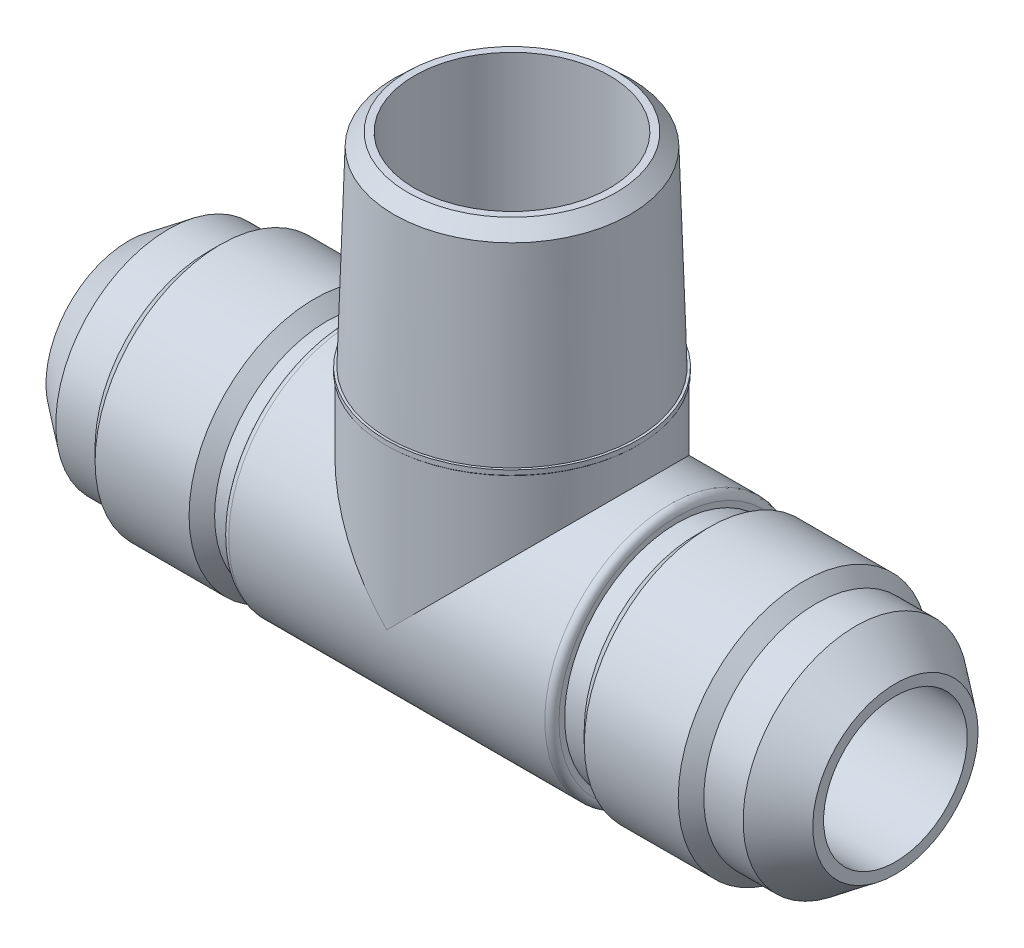
ISO-10303-21;
HEADER;
FILE_DESCRIPTION(('STEP AP214'),'2;1');
FILE_NAME('part.step','',(''),(''),'','','');
FILE_SCHEMA(('AUTOMOTIVE_DESIGN { 1 0 10303 214 1 1 1 1 }'));
ENDSEC;
DATA;
#1=APPLICATION_CONTEXT('core data for automotive mechanical design processes');
#2=APPLICATION_PROTOCOL_DEFINITION('international standard','automotive_design',2000,#1);
#3=PRODUCT_CONTEXT('',#1,'mechanical');
#4=PRODUCT('Part','Part','',(#3));
#5=PRODUCT_RELATED_PRODUCT_CATEGORY('part','',(#4));
#6=PRODUCT_DEFINITION_FORMATION('','',#4);
#7=PRODUCT_DEFINITION_CONTEXT('part definition',#1,'design');
#8=PRODUCT_DEFINITION('design','',#6,#7);
#9=PRODUCT_DEFINITION_SHAPE('','',#8);
#10=(LENGTH_UNIT() NAMED_UNIT(*) SI_UNIT(.MILLI.,.METRE.));
#11=(NAMED_UNIT(*) PLANE_ANGLE_UNIT() SI_UNIT($,.RADIAN.));
#12=(NAMED_UNIT(*) SI_UNIT($,.STERADIAN.) SOLID_ANGLE_UNIT());
#13=UNCERTAINTY_MEASURE_WITH_UNIT(LENGTH_MEASURE(1.E-05),#10,'distance_accuracy_value','');
#14=(GEOMETRIC_REPRESENTATION_CONTEXT(3) GLOBAL_UNCERTAINTY_ASSIGNED_CONTEXT((#13)) GLOBAL_UNIT_ASSIGNED_CONTEXT((#10,
#11,#12)) REPRESENTATION_CONTEXT('',''));
#15=CARTESIAN_POINT('',(0.,0.,0.));
#16=DIRECTION('',(0.,0.,1.));
#17=DIRECTION('',(1.,0.,0.));
#18=AXIS2_PLACEMENT_3D('',#15,#16,#17);
#19=CARTESIAN_POINT('',(-41.275,0.,0.));
#20=DIRECTION('',(1.,0.,0.));
#21=DIRECTION('',(0.,0.,-1.));
#22=AXIS2_PLACEMENT_3D('',#19,#20,#21);
#23=CYLINDRICAL_SURFACE('',#22,7.7343);
#24=CARTESIAN_POINT('',(41.275,-2.88221784521501E-13,0.));
#25=DIRECTION('',(-1.,0.,0.));
#26=DIRECTION('',(0.,0.,-1.));
#27=AXIS2_PLACEMENT_3D('',#24,#25,#26);
#28=CIRCLE('',#27,7.7343);
#29=CARTESIAN_POINT('',(41.275,-2.88221784521501E-13,-7.7343));
#30=VERTEX_POINT('',#29);
#31=EDGE_CURVE('E79',#30,#30,#28,.T.);
#32=ORIENTED_EDGE('',*,*,#31,.F.);
#33=EDGE_LOOP('',(#32));
#34=FACE_BOUND('',#33,.T.);
#35=CARTESIAN_POINT('',(-41.275,0.,0.));
#36=DIRECTION('',(1.,0.,0.));
#37=DIRECTION('',(0.,0.,-1.));
#38=AXIS2_PLACEMENT_3D('',#35,#36,#37);
#39=CIRCLE('',#38,7.7343);
#40=CARTESIAN_POINT('',(-41.275,0.,-7.7343));
#41=VERTEX_POINT('',#40);
#42=EDGE_CURVE('E127',#41,#41,#39,.T.);
#43=ORIENTED_EDGE('',*,*,#42,.F.);
#44=EDGE_LOOP('',(#43));
#45=FACE_BOUND('',#44,.T.);
#46=CARTESIAN_POINT('',(0.,0.,0.));
#47=DIRECTION('',(0.707106781186548,-0.707106781186547,0.));
#48=DIRECTION('',(0.707106781186548,0.707106781186547,0.));
#49=AXIS2_PLACEMENT_3D('',#46,#47,#48);
#50=ELLIPSE('',#49,10.9379519554622,7.7343);
#51=CARTESIAN_POINT('',(0.,0.,-7.7343));
#52=VERTEX_POINT('',#51);
#53=CARTESIAN_POINT('',(0.,0.,7.7343));
#54=VERTEX_POINT('',#53);
#55=EDGE_CURVE('E55',#52,#54,#50,.T.);
#56=ORIENTED_EDGE('',*,*,#55,.F.);
#57=CARTESIAN_POINT('',(0.,0.,0.));
#58=DIRECTION('',(0.707106781186548,0.707106781186547,0.));
#59=DIRECTION('',(0.707106781186548,-0.707106781186547,0.));
#60=AXIS2_PLACEMENT_3D('',#57,#58,#59);
#61=ELLIPSE('',#60,10.9379519554622,7.7343);
#62=EDGE_CURVE('E67',#54,#52,#61,.F.);
#63=ORIENTED_EDGE('',*,*,#62,.F.);
#64=EDGE_LOOP('',(#56,#63));
#65=FACE_BOUND('',#64,.T.);
#66=ADVANCED_FACE('F40',(#34,#45,#65),#23,.F.);
#67=CARTESIAN_POINT('',(0.,17.78,0.));
#68=DIRECTION('',(0.,1.,0.));
#69=DIRECTION('',(0.,0.,1.));
#70=AXIS2_PLACEMENT_3D('',#67,#68,#69);
#71=PLANE('',#70);
#72=CARTESIAN_POINT('',(0.,17.78,0.));
#73=DIRECTION('',(0.,1.,0.));
#74=DIRECTION('',(0.,0.,1.));
#75=AXIS2_PLACEMENT_3D('',#72,#73,#74);
#76=CIRCLE('',#75,10.4994122957537);
#77=CARTESIAN_POINT('',(0.,17.78,10.4994122957537));
#78=VERTEX_POINT('',#77);
#79=EDGE_CURVE('E115',#78,#78,#76,.T.);
#80=ORIENTED_EDGE('',*,*,#79,.T.);
#81=EDGE_LOOP('',(#80));
#82=FACE_BOUND('',#81,.T.);
#83=CARTESIAN_POINT('',(0.,17.78,0.));
#84=DIRECTION('',(0.,1.,0.));
#85=DIRECTION('',(0.,0.,1.));
#86=AXIS2_PLACEMENT_3D('',#83,#84,#85);
#87=CIRCLE('',#86,7.7343);
#88=CARTESIAN_POINT('',(0.,17.78,7.7343));
#89=VERTEX_POINT('',#88);
#90=EDGE_CURVE('E44',#89,#89,#87,.F.);
#91=ORIENTED_EDGE('',*,*,#90,.T.);
#92=EDGE_LOOP('',(#91));
#93=FACE_BOUND('',#92,.T.);
#94=ADVANCED_FACE('F192',(#82,#93),#71,.T.);
#95=CARTESIAN_POINT('',(-17.78,0.,0.));
#96=DIRECTION('',(-1.,0.,0.));
#97=DIRECTION('',(0.,0.,1.));
#98=AXIS2_PLACEMENT_3D('',#95,#96,#97);
#99=CYLINDRICAL_SURFACE('',#98,13.49375);
#100=CARTESIAN_POINT('',(-21.2714819951744,0.,0.));
#101=DIRECTION('',(1.,0.,0.));
#102=DIRECTION('',(0.,1.,0.));
#103=AXIS2_PLACEMENT_3D('',#100,#101,#102);
#104=CIRCLE('',#103,13.49375);
#105=CARTESIAN_POINT('',(-21.2714819951744,0.,13.49375));
#106=VERTEX_POINT('',#105);
#107=EDGE_CURVE('E130',#106,#106,#104,.T.);
#108=CARTESIAN_POINT('',(-31.3878090172366,0.,0.));
#109=DIRECTION('',(1.,0.,0.));
#110=DIRECTION('',(0.,1.,0.));
#111=AXIS2_PLACEMENT_3D('',#108,#109,#110);
#112=CIRCLE('',#111,13.49375);
#113=CARTESIAN_POINT('',(-31.3878090172366,0.,13.49375));
#114=VERTEX_POINT('',#113);
#115=EDGE_CURVE('E139',#114,#114,#112,.T.);
#116=CARTESIAN_POINT('',(-21.2714819951744,0.,13.49375));
#117=CARTESIAN_POINT('',(-21.3768604016543,0.,13.49375));
#118=CARTESIAN_POINT('',(-21.4822388081341,0.,13.49375));
#119=CARTESIAN_POINT('',(-21.6929956210937,0.,13.49375));
#120=CARTESIAN_POINT('',(-21.7983740275735,0.,13.49375));
#121=CARTESIAN_POINT('',(-22.0091308405331,0.,13.49375));
#122=CARTESIAN_POINT('',(-22.114509247013,0.,13.49375));
#123=CARTESIAN_POINT('',(-22.3252660599726,0.,13.49375));
#124=CARTESIAN_POINT('',(-22.4306444664524,0.,13.49375));
#125=CARTESIAN_POINT('',(-22.641401279412,0.,13.49375));
#126=CARTESIAN_POINT('',(-22.7467796858918,0.,13.49375));
#127=CARTESIAN_POINT('',(-22.9575364988515,0.,13.49375));
#128=CARTESIAN_POINT('',(-23.0629149053313,0.,13.49375));
#129=CARTESIAN_POINT('',(-23.2736717182909,0.,13.49375));
#130=CARTESIAN_POINT('',(-23.3790501247707,0.,13.49375));
#131=CARTESIAN_POINT('',(-23.5898069377304,0.,13.49375));
#132=CARTESIAN_POINT('',(-23.6951853442102,0.,13.49375));
#133=CARTESIAN_POINT('',(-23.9059421571698,0.,13.49375));
#134=CARTESIAN_POINT('',(-24.0113205636496,0.,13.49375));
#135=CARTESIAN_POINT('',(-24.2220773766092,0.,13.49375));
#136=CARTESIAN_POINT('',(-24.3274557830891,0.,13.49375));
#137=CARTESIAN_POINT('',(-24.5382125960487,0.,13.49375));
#138=CARTESIAN_POINT('',(-24.6435910025285,0.,13.49375));
#139=CARTESIAN_POINT('',(-24.8543478154881,0.,13.49375));
#140=CARTESIAN_POINT('',(-24.9597262219679,0.,13.49375));
#141=CARTESIAN_POINT('',(-25.1704830349276,0.,13.49375));
#142=CARTESIAN_POINT('',(-25.2758614414074,0.,13.49375));
#143=CARTESIAN_POINT('',(-25.486618254367,0.,13.49375));
#144=CARTESIAN_POINT('',(-25.5919966608468,0.,13.49375));
#145=CARTESIAN_POINT('',(-25.8027534738065,0.,13.49375));
#146=CARTESIAN_POINT('',(-25.9081318802863,0.,13.49375));
#147=CARTESIAN_POINT('',(-26.1188886932459,0.,13.49375));
#148=CARTESIAN_POINT('',(-26.2242670997257,0.,13.49375));
#149=CARTESIAN_POINT('',(-26.4350239126853,0.,13.49375));
#150=CARTESIAN_POINT('',(-26.5404023191652,0.,13.49375));
#151=CARTESIAN_POINT('',(-26.7511591321248,0.,13.49375));
#152=CARTESIAN_POINT('',(-26.8565375386046,0.,13.49375));
#153=CARTESIAN_POINT('',(-27.0672943515642,0.,13.49375));
#154=CARTESIAN_POINT('',(-27.172672758044,0.,13.49375));
#155=CARTESIAN_POINT('',(-27.3834295710037,0.,13.49375));
#156=CARTESIAN_POINT('',(-27.4888079774835,0.,13.49375));
#157=CARTESIAN_POINT('',(-27.6995647904431,0.,13.49375));
#158=CARTESIAN_POINT('',(-27.8049431969229,0.,13.49375));
#159=CARTESIAN_POINT('',(-28.0157000098826,0.,13.49375));
#160=CARTESIAN_POINT('',(-28.1210784163624,0.,13.49375));
#161=CARTESIAN_POINT('',(-28.331835229322,0.,13.49375));
#162=CARTESIAN_POINT('',(-28.4372136358018,0.,13.49375));
#163=CARTESIAN_POINT('',(-28.6479704487614,0.,13.49375));
#164=CARTESIAN_POINT('',(-28.7533488552413,0.,13.49375));
#165=CARTESIAN_POINT('',(-28.9641056682009,0.,13.49375));
#166=CARTESIAN_POINT('',(-29.0694840746807,0.,13.49375));
#167=CARTESIAN_POINT('',(-29.2802408876403,0.,13.49375));
#168=CARTESIAN_POINT('',(-29.3856192941201,0.,13.49375));
#169=CARTESIAN_POINT('',(-29.5963761070798,0.,13.49375));
#170=CARTESIAN_POINT('',(-29.7017545135596,0.,13.49375));
#171=CARTESIAN_POINT('',(-29.9125113265192,0.,13.49375));
#172=CARTESIAN_POINT('',(-30.017889732999,0.,13.49375));
#173=CARTESIAN_POINT('',(-30.2286465459587,0.,13.49375));
#174=CARTESIAN_POINT('',(-30.3340249524385,0.,13.49375));
#175=CARTESIAN_POINT('',(-30.5447817653981,0.,13.49375));
#176=CARTESIAN_POINT('',(-30.6501601718779,0.,13.49375));
#177=CARTESIAN_POINT('',(-30.8609169848375,0.,13.49375));
#178=CARTESIAN_POINT('',(-30.9662953913174,0.,13.49375));
#179=CARTESIAN_POINT('',(-31.177052204277,0.,13.49375));
#180=CARTESIAN_POINT('',(-31.2824306107568,0.,13.49375));
#181=CARTESIAN_POINT('',(-31.3878090172366,0.,13.49375));
#182=B_SPLINE_CURVE_WITH_KNOTS('',3,(#116,#117,#118,#119,#120,#121,#122,#123,#124,#125,#126,
#127,#128,#129,#130,#131,#132,#133,#134,#135,#136,#137,#138,#139,#140,#141,#142,#143,#144,#145,
#146,#147,#148,#149,#150,#151,#152,#153,#154,#155,#156,#157,#158,#159,#160,#161,#162,#163,#164,
#165,#166,#167,#168,#169,#170,#171,#172,#173,#174,#175,#176,#177,#178,#179,#180,#181),
.UNSPECIFIED.,.F.,.F.,(4,2,2,2,2,2,2,2,2,2,2,2,2,2,2,2,2,2,2,2,2,2,2,2,2,2,2,2,2,2,2,2,4),(0.,
0.316135219439444,0.632270438878885,0.94840565831833,1.26454087775777,1.58067609719722,
1.89681131663666,2.2129465360761,2.52908175551554,2.84521697495498,3.16135219439443,
3.47748741383387,3.79362263327331,4.10975785271275,4.4258930721522,4.74202829159164,
5.05816351103108,5.37429873047052,5.69043394990997,6.00656916934941,6.32270438878885,
6.63883960822829,6.95497482766774,7.27111004710718,7.58724526654662,7.90338048598606,
8.21951570542551,8.53565092486495,8.85178614430439,9.16792136374383,9.48405658318327,
9.80019180262272,10.1163270220622),.UNSPECIFIED.);
#183=EDGE_CURVE('BSEAM198',#106,#114,#182,.T.);
#184=ORIENTED_EDGE('',*,*,#107,.F.);
#185=ORIENTED_EDGE('',*,*,#115,.T.);
#186=ORIENTED_EDGE('',*,*,#183,.T.);
#187=ORIENTED_EDGE('',*,*,#183,.F.);
#188=EDGE_LOOP('',(#184,#186,#185,#187));
#189=FACE_BOUND('',#188,.T.);
#190=ADVANCED_FACE('F198',(#189),#99,.T.);
#191=CARTESIAN_POINT('',(-32.7626243457444,0.,0.));
#192=DIRECTION('',(1.,0.,0.));
#193=DIRECTION('',(0.,1.,0.));
#194=AXIS2_PLACEMENT_3D('',#191,#192,#193);
#195=CONICAL_SURFACE('',#194,12.1189346714922,0.78539816339745);
#196=ORIENTED_EDGE('',*,*,#115,.F.);
#197=EDGE_LOOP('',(#196));
#198=FACE_BOUND('',#197,.T.);
#199=CARTESIAN_POINT('',(-32.7626243457444,0.,0.));
#200=DIRECTION('',(1.,0.,0.));
#201=DIRECTION('',(0.,1.,0.));
#202=AXIS2_PLACEMENT_3D('',#199,#200,#201);
#203=CIRCLE('',#202,12.1189346714922);
#204=CARTESIAN_POINT('',(-32.7626243457444,12.1189346714922,0.));
#205=VERTEX_POINT('',#204);
#206=EDGE_CURVE('E148',#205,#205,#203,.T.);
#207=ORIENTED_EDGE('',*,*,#206,.T.);
#208=EDGE_LOOP('',(#207));
#209=FACE_BOUND('',#208,.T.);
#210=ADVANCED_FACE('F225',(#198,#209),#195,.T.);
#211=CARTESIAN_POINT('',(0.,0.,0.));
#212=DIRECTION('',(1.,0.,0.));
#213=DIRECTION('',(0.,1.,0.));
#214=AXIS2_PLACEMENT_3D('',#211,#212,#213);
#215=CYLINDRICAL_SURFACE('',#214,12.1189346714922);
#216=ORIENTED_EDGE('',*,*,#206,.F.);
#217=EDGE_LOOP('',(#216));
#218=FACE_BOUND('',#217,.T.);
#219=CARTESIAN_POINT('',(-36.9959576790777,0.,0.));
#220=DIRECTION('',(1.,0.,0.));
#221=DIRECTION('',(0.,1.,0.));
#222=AXIS2_PLACEMENT_3D('',#219,#220,#221);
#223=CIRCLE('',#222,12.1189346714922);
#224=CARTESIAN_POINT('',(-36.9959576790777,12.1189346714922,0.));
#225=VERTEX_POINT('',#224);
#226=EDGE_CURVE('E145',#225,#225,#223,.T.);
#227=ORIENTED_EDGE('',*,*,#226,.T.);
#228=EDGE_LOOP('',(#227));
#229=FACE_BOUND('',#228,.T.);
#230=ADVANCED_FACE('F221',(#218,#229),#215,.T.);
#231=CARTESIAN_POINT('',(-41.275,0.,0.));
#232=DIRECTION('',(1.,0.,0.));
#233=DIRECTION('',(0.,1.,0.));
#234=AXIS2_PLACEMENT_3D('',#231,#232,#233);
#235=CONICAL_SURFACE('',#234,8.894445,0.645771823237897);
#236=ORIENTED_EDGE('',*,*,#226,.F.);
#237=EDGE_LOOP('',(#236));
#238=FACE_BOUND('',#237,.T.);
#239=CARTESIAN_POINT('',(-41.275,0.,0.));
#240=DIRECTION('',(1.,0.,0.));
#241=DIRECTION('',(0.,1.,0.));
#242=AXIS2_PLACEMENT_3D('',#239,#240,#241);
#243=CIRCLE('',#242,8.894445);
#244=CARTESIAN_POINT('',(-41.275,8.894445,0.));
#245=VERTEX_POINT('',#244);
#246=EDGE_CURVE('E142',#245,#245,#243,.T.);
#247=ORIENTED_EDGE('',*,*,#246,.T.);
#248=EDGE_LOOP('',(#247));
#249=FACE_BOUND('',#248,.T.);
#250=ADVANCED_FACE('F218',(#238,#249),#235,.T.);
#251=CARTESIAN_POINT('',(-41.275,0.,0.));
#252=DIRECTION('',(1.,0.,0.));
#253=DIRECTION('',(0.,0.,-1.));
#254=AXIS2_PLACEMENT_3D('',#251,#252,#253);
#255=PLANE('',#254);
#256=ORIENTED_EDGE('',*,*,#42,.T.);
#257=EDGE_LOOP('',(#256));
#258=FACE_BOUND('',#257,.T.);
#259=ORIENTED_EDGE('',*,*,#246,.F.);
#260=EDGE_LOOP('',(#259));
#261=FACE_BOUND('',#260,.T.);
#262=ADVANCED_FACE('F216',(#258,#261),#255,.F.);
#263=CARTESIAN_POINT('',(0.,0.,0.));
#264=DIRECTION('',(1.,0.,0.));
#265=DIRECTION('',(0.,1.,0.));
#266=AXIS2_PLACEMENT_3D('',#263,#264,#265);
#267=CYLINDRICAL_SURFACE('',#266,12.1189346714922);
#268=CARTESIAN_POINT('',(-17.78,0.,0.));
#269=DIRECTION('',(1.,0.,0.));
#270=DIRECTION('',(0.,1.,0.));
#271=AXIS2_PLACEMENT_3D('',#268,#269,#270);
#272=CIRCLE('',#271,12.1189346714922);
#273=CARTESIAN_POINT('',(-17.78,12.1189346714922,0.));
#274=VERTEX_POINT('',#273);
#275=EDGE_CURVE('E136',#274,#274,#272,.T.);
#276=ORIENTED_EDGE('',*,*,#275,.F.);
#277=EDGE_LOOP('',(#276));
#278=FACE_BOUND('',#277,.T.);
#279=CARTESIAN_POINT('',(-19.8966666666667,0.,0.));
#280=DIRECTION('',(1.,0.,0.));
#281=DIRECTION('',(0.,1.,0.));
#282=AXIS2_PLACEMENT_3D('',#279,#280,#281);
#283=CIRCLE('',#282,12.1189346714922);
#284=CARTESIAN_POINT('',(-19.8966666666667,12.1189346714922,0.));
#285=VERTEX_POINT('',#284);
#286=EDGE_CURVE('E133',#285,#285,#283,.T.);
#287=ORIENTED_EDGE('',*,*,#286,.T.);
#288=EDGE_LOOP('',(#287));
#289=FACE_BOUND('',#288,.T.);
#290=ADVANCED_FACE('F212',(#278,#289),#267,.T.);
#291=CARTESIAN_POINT('',(-21.2714819951744,0.,0.));
#292=DIRECTION('',(-1.,0.,0.));
#293=DIRECTION('',(0.,-1.,0.));
#294=AXIS2_PLACEMENT_3D('',#291,#292,#293);
#295=CONICAL_SURFACE('',#294,13.49375,0.785398163397451);
#296=ORIENTED_EDGE('',*,*,#286,.F.);
#297=EDGE_LOOP('',(#296));
#298=FACE_BOUND('',#297,.T.);
#299=ORIENTED_EDGE('',*,*,#107,.T.);
#300=EDGE_LOOP('',(#299));
#301=FACE_BOUND('',#300,.T.);
#302=ADVANCED_FACE('F208',(#298,#301),#295,.T.);
#303=CARTESIAN_POINT('',(-17.78,0.,0.));
#304=DIRECTION('',(1.,0.,0.));
#305=DIRECTION('',(0.,0.,-1.));
#306=AXIS2_PLACEMENT_3D('',#303,#304,#305);
#307=PLANE('',#306);
#308=CARTESIAN_POINT('',(-17.78,0.,0.));
#309=DIRECTION('',(1.,0.,0.));
#310=DIRECTION('',(0.,0.,-1.));
#311=AXIS2_PLACEMENT_3D('',#308,#309,#310);
#312=CIRCLE('',#311,12.7254);
#313=CARTESIAN_POINT('',(-17.78,0.,-12.7254));
#314=VERTEX_POINT('',#313);
#315=EDGE_CURVE('E49',#314,#314,#312,.F.);
#316=ORIENTED_EDGE('',*,*,#315,.T.);
#317=EDGE_LOOP('',(#316));
#318=FACE_BOUND('',#317,.T.);
#319=ORIENTED_EDGE('',*,*,#275,.T.);
#320=EDGE_LOOP('',(#319));
#321=FACE_BOUND('',#320,.T.);
#322=ADVANCED_FACE('F157',(#318,#321),#307,.F.);
#323=CARTESIAN_POINT('',(0.,0.,0.));
#324=DIRECTION('',(-1.,0.,0.));
#325=DIRECTION('',(0.,0.,1.));
#326=AXIS2_PLACEMENT_3D('',#323,#324,#325);
#327=CYLINDRICAL_SURFACE('',#326,13.4874);
#328=CARTESIAN_POINT('',(-17.018,0.,0.));
#329=DIRECTION('',(1.,0.,0.));
#330=DIRECTION('',(0.,0.,-1.));
#331=AXIS2_PLACEMENT_3D('',#328,#329,#330);
#332=CIRCLE('',#331,13.4874);
#333=CARTESIAN_POINT('',(-17.018,0.,-13.4874));
#334=VERTEX_POINT('',#333);
#335=EDGE_CURVE('E151',#334,#334,#332,.T.);
#336=ORIENTED_EDGE('',*,*,#335,.T.);
#337=EDGE_LOOP('',(#336));
#338=FACE_BOUND('',#337,.T.);
#339=CARTESIAN_POINT('',(0.,0.,0.));
#340=DIRECTION('',(-0.707106781186547,-0.707106781186547,0.));
#341=DIRECTION('',(-0.707106781186547,0.707106781186547,0.));
#342=AXIS2_PLACEMENT_3D('',#339,#340,#341);
#343=ELLIPSE('',#342,19.0740640011509,13.4874);
#344=CARTESIAN_POINT('',(0.,0.,13.4874));
#345=VERTEX_POINT('',#344);
#346=CARTESIAN_POINT('',(0.,0.,-13.4874));
#347=VERTEX_POINT('',#346);
#348=EDGE_CURVE('E62',#345,#347,#343,.T.);
#349=ORIENTED_EDGE('',*,*,#348,.T.);
#350=CARTESIAN_POINT('',(0.,0.,0.));
#351=DIRECTION('',(-0.707106781186545,0.70710678118655,0.));
#352=DIRECTION('',(0.70710678118655,0.707106781186545,0.));
#353=AXIS2_PLACEMENT_3D('',#350,#351,#352);
#354=ELLIPSE('',#353,19.0740640011508,13.4874);
#355=EDGE_CURVE('E109',#345,#347,#354,.T.);
#356=ORIENTED_EDGE('',*,*,#355,.F.);
#357=EDGE_LOOP('',(#349,#356));
#358=FACE_BOUND('',#357,.T.);
#359=CARTESIAN_POINT('',(17.018,-1.15366611896911E-13,0.));
#360=DIRECTION('',(-1.,0.,0.));
#361=DIRECTION('',(0.,0.,-1.));
#362=AXIS2_PLACEMENT_3D('',#359,#360,#361);
#363=CIRCLE('',#362,13.4874);
#364=CARTESIAN_POINT('',(17.018,-1.15366611896911E-13,-13.4874));
#365=VERTEX_POINT('',#364);
#366=EDGE_CURVE('E103',#365,#365,#363,.T.);
#367=ORIENTED_EDGE('',*,*,#366,.T.);
#368=EDGE_LOOP('',(#367));
#369=FACE_BOUND('',#368,.T.);
#370=ADVANCED_FACE('F163',(#338,#358,#369),#327,.T.);
#371=CARTESIAN_POINT('',(-17.018,0.,0.));
#372=DIRECTION('',(1.,0.,0.));
#373=DIRECTION('',(0.,0.,-1.));
#374=AXIS2_PLACEMENT_3D('',#371,#372,#373);
#375=TOROIDAL_SURFACE('',#374,12.7254,0.762);
#376=ORIENTED_EDGE('',*,*,#315,.F.);
#377=EDGE_LOOP('',(#376));
#378=FACE_BOUND('',#377,.T.);
#379=ORIENTED_EDGE('',*,*,#335,.F.);
#380=EDGE_LOOP('',(#379));
#381=FACE_BOUND('',#380,.T.);
#382=ADVANCED_FACE('F42',(#378,#381),#375,.T.);
#383=CARTESIAN_POINT('',(0.,0.,0.));
#384=DIRECTION('',(0.,1.,0.));
#385=DIRECTION('',(0.,0.,1.));
#386=AXIS2_PLACEMENT_3D('',#383,#384,#385);
#387=CYLINDRICAL_SURFACE('',#386,13.4874);
#388=CARTESIAN_POINT('',(0.,17.1772221291319,0.));
#389=DIRECTION('',(0.,1.,0.));
#390=DIRECTION('',(0.,0.,1.));
#391=AXIS2_PLACEMENT_3D('',#388,#389,#390);
#392=CIRCLE('',#391,13.4874);
#393=CARTESIAN_POINT('',(0.,17.1772221291319,13.4874));
#394=VERTEX_POINT('',#393);
#395=EDGE_CURVE('E11',#394,#394,#392,.T.);
#396=ORIENTED_EDGE('',*,*,#395,.F.);
#397=EDGE_LOOP('',(#396));
#398=FACE_BOUND('',#397,.T.);
#399=ORIENTED_EDGE('',*,*,#348,.F.);
#400=ORIENTED_EDGE('',*,*,#355,.T.);
#401=EDGE_LOOP('',(#399,#400));
#402=FACE_BOUND('',#401,.T.);
#403=ADVANCED_FACE('F162',(#398,#402),#387,.T.);
#404=CARTESIAN_POINT('',(17.78,-1.24157076409262E-13,0.));
#405=DIRECTION('',(1.,0.,0.));
#406=DIRECTION('',(0.,0.,1.));
#407=AXIS2_PLACEMENT_3D('',#404,#405,#406);
#408=CYLINDRICAL_SURFACE('',#407,13.49375);
#409=CARTESIAN_POINT('',(21.2714819951744,-1.45424904760087E-13,0.));
#410=DIRECTION('',(-1.,0.,0.));
#411=DIRECTION('',(0.,-1.,0.));
#412=AXIS2_PLACEMENT_3D('',#409,#410,#411);
#413=CIRCLE('',#412,13.49375);
#414=CARTESIAN_POINT('',(21.2714819951744,-1.48537964871379E-13,13.49375));
#415=VERTEX_POINT('',#414);
#416=EDGE_CURVE('E82',#415,#415,#413,.T.);
#417=CARTESIAN_POINT('',(31.3878090172366,-2.14586324450498E-13,0.));
#418=DIRECTION('',(-1.,0.,0.));
#419=DIRECTION('',(0.,-1.,0.));
#420=AXIS2_PLACEMENT_3D('',#417,#418,#419);
#421=CIRCLE('',#420,13.49375);
#422=CARTESIAN_POINT('',(31.3878090172366,-2.19179898901708E-13,13.49375));
#423=VERTEX_POINT('',#422);
#424=EDGE_CURVE('E91',#423,#423,#421,.T.);
#425=CARTESIAN_POINT('',(21.2714819951744,-1.48537964871379E-13,13.49375));
#426=CARTESIAN_POINT('',(21.3768604016543,-1.49273818350861E-13,13.49375));
#427=CARTESIAN_POINT('',(21.4822388081341,-1.50009671830344E-13,13.49375));
#428=CARTESIAN_POINT('',(21.6929956210937,-1.51481378789309E-13,13.49375));
#429=CARTESIAN_POINT('',(21.7983740275735,-1.52217232268792E-13,13.49375));
#430=CARTESIAN_POINT('',(22.0091308405331,-1.53688939227757E-13,13.49375));
#431=CARTESIAN_POINT('',(22.114509247013,-1.54424792707239E-13,13.49375));
#432=CARTESIAN_POINT('',(22.3252660599726,-1.55896499666205E-13,13.49375));
#433=CARTESIAN_POINT('',(22.4306444664524,-1.56632353145687E-13,13.49375));
#434=CARTESIAN_POINT('',(22.641401279412,-1.58104060104652E-13,13.49375));
#435=CARTESIAN_POINT('',(22.7467796858918,-1.58839913584135E-13,13.49375));
#436=CARTESIAN_POINT('',(22.9575364988515,-1.603116205431E-13,13.49375));
#437=CARTESIAN_POINT('',(23.0629149053313,-1.61047474022583E-13,13.49375));
#438=CARTESIAN_POINT('',(23.2736717182909,-1.62519180981548E-13,13.49375));
#439=CARTESIAN_POINT('',(23.3790501247707,-1.6325503446103E-13,13.49375));
#440=CARTESIAN_POINT('',(23.5898069377304,-1.64726741419996E-13,13.49375));
#441=CARTESIAN_POINT('',(23.6951853442102,-1.65462594899478E-13,13.49375));
#442=CARTESIAN_POINT('',(23.9059421571698,-1.66934301858443E-13,13.49375));
#443=CARTESIAN_POINT('',(24.0113205636496,-1.67670155337926E-13,13.49375));
#444=CARTESIAN_POINT('',(24.2220773766092,-1.69141862296891E-13,13.49375));
#445=CARTESIAN_POINT('',(24.3274557830891,-1.69877715776374E-13,13.49375));
#446=CARTESIAN_POINT('',(24.5382125960487,-1.71349422735339E-13,13.49375));
#447=CARTESIAN_POINT('',(24.6435910025285,-1.72085276214822E-13,13.49375));
#448=CARTESIAN_POINT('',(24.8543478154881,-1.73556983173787E-13,13.49375));
#449=CARTESIAN_POINT('',(24.9597262219679,-1.74292836653269E-13,13.49375));
#450=CARTESIAN_POINT('',(25.1704830349276,-1.75764543612235E-13,13.49375));
#451=CARTESIAN_POINT('',(25.2758614414074,-1.76500397091717E-13,13.49375));
#452=CARTESIAN_POINT('',(25.486618254367,-1.77972104050682E-13,13.49375));
#453=CARTESIAN_POINT('',(25.5919966608468,-1.78707957530165E-13,13.49375));
#454=CARTESIAN_POINT('',(25.8027534738065,-1.8017966448913E-13,13.49375));
#455=CARTESIAN_POINT('',(25.9081318802863,-1.80915517968613E-13,13.49375));
#456=CARTESIAN_POINT('',(26.1188886932459,-1.82387224927578E-13,13.49375));
#457=CARTESIAN_POINT('',(26.2242670997257,-1.8312307840706E-13,13.49375));
#458=CARTESIAN_POINT('',(26.4350239126853,-1.84594785366026E-13,13.49375));
#459=CARTESIAN_POINT('',(26.5404023191651,-1.85330638845508E-13,13.49375));
#460=CARTESIAN_POINT('',(26.7511591321248,-1.86802345804473E-13,13.49375));
#461=CARTESIAN_POINT('',(26.8565375386046,-1.87538199283956E-13,13.49375));
#462=CARTESIAN_POINT('',(27.0672943515642,-1.89009906242921E-13,13.49375));
#463=CARTESIAN_POINT('',(27.172672758044,-1.89745759722404E-13,13.49375));
#464=CARTESIAN_POINT('',(27.3834295710037,-1.91217466681369E-13,13.49375));
#465=CARTESIAN_POINT('',(27.4888079774835,-1.91953320160852E-13,13.49375));
#466=CARTESIAN_POINT('',(27.6995647904431,-1.93425027119817E-13,13.49375));
#467=CARTESIAN_POINT('',(27.8049431969229,-1.94160880599299E-13,13.49375));
#468=CARTESIAN_POINT('',(28.0157000098825,-1.95632587558265E-13,13.49375));
#469=CARTESIAN_POINT('',(28.1210784163624,-1.96368441037747E-13,13.49375));
#470=CARTESIAN_POINT('',(28.331835229322,-1.97840147996712E-13,13.49375));
#471=CARTESIAN_POINT('',(28.4372136358018,-1.98576001476195E-13,13.49375));
#472=CARTESIAN_POINT('',(28.6479704487614,-2.0004770843516E-13,13.49375));
#473=CARTESIAN_POINT('',(28.7533488552412,-2.00783561914643E-13,13.49375));
#474=CARTESIAN_POINT('',(28.9641056682009,-2.02255268873608E-13,13.49375));
#475=CARTESIAN_POINT('',(29.0694840746807,-2.02991122353091E-13,13.49375));
#476=CARTESIAN_POINT('',(29.2802408876403,-2.04462829312056E-13,13.49375));
#477=CARTESIAN_POINT('',(29.3856192941201,-2.05198682791538E-13,13.49375));
#478=CARTESIAN_POINT('',(29.5963761070798,-2.06670389750504E-13,13.49375));
#479=CARTESIAN_POINT('',(29.7017545135596,-2.07406243229986E-13,13.49375));
#480=CARTESIAN_POINT('',(29.9125113265192,-2.08877950188951E-13,13.49375));
#481=CARTESIAN_POINT('',(30.017889732999,-2.09613803668434E-13,13.49375));
#482=CARTESIAN_POINT('',(30.2286465459586,-2.11085510627399E-13,13.49375));
#483=CARTESIAN_POINT('',(30.3340249524385,-2.11821364106882E-13,13.49375));
#484=CARTESIAN_POINT('',(30.5447817653981,-2.13293071065847E-13,13.49375));
#485=CARTESIAN_POINT('',(30.6501601718779,-2.14028924545329E-13,13.49375));
#486=CARTESIAN_POINT('',(30.8609169848375,-2.15500631504295E-13,13.49375));
#487=CARTESIAN_POINT('',(30.9662953913173,-2.16236484983777E-13,13.49375));
#488=CARTESIAN_POINT('',(31.177052204277,-2.17708191942742E-13,13.49375));
#489=CARTESIAN_POINT('',(31.2824306107568,-2.18444045422225E-13,13.49375));
#490=CARTESIAN_POINT('',(31.3878090172366,-2.19179898901708E-13,13.49375));
#491=B_SPLINE_CURVE_WITH_KNOTS('',3,(#425,#426,#427,#428,#429,#430,#431,#432,#433,#434,#435,
#436,#437,#438,#439,#440,#441,#442,#443,#444,#445,#446,#447,#448,#449,#450,#451,#452,#453,#454,
#455,#456,#457,#458,#459,#460,#461,#462,#463,#464,#465,#466,#467,#468,#469,#470,#471,#472,#473,
#474,#475,#476,#477,#478,#479,#480,#481,#482,#483,#484,#485,#486,#487,#488,#489,#490),
.UNSPECIFIED.,.F.,.F.,(4,2,2,2,2,2,2,2,2,2,2,2,2,2,2,2,2,2,2,2,2,2,2,2,2,2,2,2,2,2,2,2,4),(0.,
0.316135219439441,0.632270438878882,0.948405658318326,1.26454087775777,1.58067609719721,
1.89681131663665,2.21294653607609,2.52908175551554,2.84521697495498,3.16135219439442,
3.47748741383386,3.79362263327331,4.10975785271275,4.42589307215219,4.74202829159163,
5.05816351103107,5.37429873047051,5.69043394990996,6.0065691693494,6.32270438878884,
6.63883960822828,6.95497482766773,7.27111004710717,7.58724526654661,7.90338048598606,
8.2195157054255,8.53565092486494,8.85178614430438,9.16792136374383,9.48405658318327,
9.80019180262271,10.1163270220621),.UNSPECIFIED.);
#492=EDGE_CURVE('BSEAM302',#415,#423,#491,.T.);
#493=ORIENTED_EDGE('',*,*,#416,.F.);
#494=ORIENTED_EDGE('',*,*,#424,.T.);
#495=ORIENTED_EDGE('',*,*,#492,.T.);
#496=ORIENTED_EDGE('',*,*,#492,.F.);
#497=EDGE_LOOP('',(#493,#495,#494,#496));
#498=FACE_BOUND('',#497,.T.);
#499=ADVANCED_FACE('F302',(#498),#408,.T.);
#500=CARTESIAN_POINT('',(32.7626243457444,-2.23985405730133E-13,0.));
#501=DIRECTION('',(-1.,0.,0.));
#502=DIRECTION('',(0.,-1.,0.));
#503=AXIS2_PLACEMENT_3D('',#500,#501,#502);
#504=CONICAL_SURFACE('',#503,12.1189346714922,0.78539816339745);
#505=ORIENTED_EDGE('',*,*,#424,.F.);
#506=EDGE_LOOP('',(#505));
#507=FACE_BOUND('',#506,.T.);
#508=CARTESIAN_POINT('',(32.7626243457444,-2.23985405730133E-13,0.));
#509=DIRECTION('',(-1.,0.,0.));
#510=DIRECTION('',(0.,-1.,0.));
#511=AXIS2_PLACEMENT_3D('',#508,#509,#510);
#512=CIRCLE('',#511,12.1189346714922);
#513=CARTESIAN_POINT('',(32.7626243457443,-12.1189346714924,0.));
#514=VERTEX_POINT('',#513);
#515=EDGE_CURVE('E100',#514,#514,#512,.T.);
#516=ORIENTED_EDGE('',*,*,#515,.T.);
#517=EDGE_LOOP('',(#516));
#518=FACE_BOUND('',#517,.T.);
#519=ADVANCED_FACE('F311',(#507,#518),#504,.T.);
#520=CARTESIAN_POINT('',(0.,0.,0.));
#521=DIRECTION('',(-1.,0.,0.));
#522=DIRECTION('',(0.,-1.,0.));
#523=AXIS2_PLACEMENT_3D('',#520,#521,#522);
#524=CYLINDRICAL_SURFACE('',#523,12.1189346714922);
#525=ORIENTED_EDGE('',*,*,#515,.F.);
#526=EDGE_LOOP('',(#525));
#527=FACE_BOUND('',#526,.T.);
#528=CARTESIAN_POINT('',(36.9959576790777,-2.52927070300442E-13,0.));
#529=DIRECTION('',(-1.,0.,0.));
#530=DIRECTION('',(0.,-1.,0.));
#531=AXIS2_PLACEMENT_3D('',#528,#529,#530);
#532=CIRCLE('',#531,12.1189346714922);
#533=CARTESIAN_POINT('',(36.9959576790776,-12.1189346714925,0.));
#534=VERTEX_POINT('',#533);
#535=EDGE_CURVE('E97',#534,#534,#532,.T.);
#536=ORIENTED_EDGE('',*,*,#535,.T.);
#537=EDGE_LOOP('',(#536));
#538=FACE_BOUND('',#537,.T.);
#539=ADVANCED_FACE('F319',(#527,#538),#524,.T.);
#540=CARTESIAN_POINT('',(41.275,-2.8218122956051E-13,0.));
#541=DIRECTION('',(-1.,0.,0.));
#542=DIRECTION('',(0.,-1.,0.));
#543=AXIS2_PLACEMENT_3D('',#540,#541,#542);
#544=CONICAL_SURFACE('',#543,8.894445,0.645771823237897);
#545=ORIENTED_EDGE('',*,*,#535,.F.);
#546=EDGE_LOOP('',(#545));
#547=FACE_BOUND('',#546,.T.);
#548=CARTESIAN_POINT('',(41.275,-2.8218122956051E-13,0.));
#549=DIRECTION('',(-1.,0.,0.));
#550=DIRECTION('',(0.,-1.,0.));
#551=AXIS2_PLACEMENT_3D('',#548,#549,#550);
#552=CIRCLE('',#551,8.894445);
#553=CARTESIAN_POINT('',(41.2749999999999,-8.89444500000029,0.));
#554=VERTEX_POINT('',#553);
#555=EDGE_CURVE('E94',#554,#554,#552,.T.);
#556=ORIENTED_EDGE('',*,*,#555,.T.);
#557=EDGE_LOOP('',(#556));
#558=FACE_BOUND('',#557,.T.);
#559=ADVANCED_FACE('F328',(#547,#558),#544,.T.);
#560=CARTESIAN_POINT('',(41.275,-2.88221784521501E-13,0.));
#561=DIRECTION('',(-1.,0.,0.));
#562=DIRECTION('',(0.,0.,-1.));
#563=AXIS2_PLACEMENT_3D('',#560,#561,#562);
#564=PLANE('',#563);
#565=ORIENTED_EDGE('',*,*,#31,.T.);
#566=EDGE_LOOP('',(#565));
#567=FACE_BOUND('',#566,.T.);
#568=ORIENTED_EDGE('',*,*,#555,.F.);
#569=EDGE_LOOP('',(#568));
#570=FACE_BOUND('',#569,.T.);
#571=ADVANCED_FACE('F335',(#567,#570),#564,.F.);
#572=CARTESIAN_POINT('',(0.,0.,0.));
#573=DIRECTION('',(-1.,0.,0.));
#574=DIRECTION('',(0.,-1.,0.));
#575=AXIS2_PLACEMENT_3D('',#572,#573,#574);
#576=CYLINDRICAL_SURFACE('',#575,12.1189346714922);
#577=CARTESIAN_POINT('',(17.78,-1.21554991195297E-13,0.));
#578=DIRECTION('',(-1.,0.,0.));
#579=DIRECTION('',(0.,-1.,0.));
#580=AXIS2_PLACEMENT_3D('',#577,#578,#579);
#581=CIRCLE('',#580,12.1189346714922);
#582=CARTESIAN_POINT('',(17.7799999999999,-12.1189346714923,0.));
#583=VERTEX_POINT('',#582);
#584=EDGE_CURVE('E88',#583,#583,#581,.T.);
#585=ORIENTED_EDGE('',*,*,#584,.F.);
#586=EDGE_LOOP('',(#585));
#587=FACE_BOUND('',#586,.T.);
#588=CARTESIAN_POINT('',(19.8966666666667,-1.36025823480451E-13,0.));
#589=DIRECTION('',(-1.,0.,0.));
#590=DIRECTION('',(0.,-1.,0.));
#591=AXIS2_PLACEMENT_3D('',#588,#589,#590);
#592=CIRCLE('',#591,12.1189346714922);
#593=CARTESIAN_POINT('',(19.8966666666666,-12.1189346714923,0.));
#594=VERTEX_POINT('',#593);
#595=EDGE_CURVE('E85',#594,#594,#592,.T.);
#596=ORIENTED_EDGE('',*,*,#595,.T.);
#597=EDGE_LOOP('',(#596));
#598=FACE_BOUND('',#597,.T.);
#599=ADVANCED_FACE('F342',(#587,#598),#576,.T.);
#600=CARTESIAN_POINT('',(21.2714819951744,-1.45424904760087E-13,0.));
#601=DIRECTION('',(1.,0.,0.));
#602=DIRECTION('',(0.,1.,0.));
#603=AXIS2_PLACEMENT_3D('',#600,#601,#602);
#604=CONICAL_SURFACE('',#603,13.49375,0.785398163397451);
#605=ORIENTED_EDGE('',*,*,#595,.F.);
#606=EDGE_LOOP('',(#605));
#607=FACE_BOUND('',#606,.T.);
#608=ORIENTED_EDGE('',*,*,#416,.T.);
#609=EDGE_LOOP('',(#608));
#610=FACE_BOUND('',#609,.T.);
#611=ADVANCED_FACE('F185',(#607,#610),#604,.T.);
#612=CARTESIAN_POINT('',(17.78,-1.20687629457308E-13,0.));
#613=DIRECTION('',(-1.,0.,0.));
#614=DIRECTION('',(0.,0.,-1.));
#615=AXIS2_PLACEMENT_3D('',#612,#613,#614);
#616=PLANE('',#615);
#617=CARTESIAN_POINT('',(17.78,-1.20687629457308E-13,0.));
#618=DIRECTION('',(-1.,0.,0.));
#619=DIRECTION('',(0.,0.,-1.));
#620=AXIS2_PLACEMENT_3D('',#617,#618,#619);
#621=CIRCLE('',#620,12.7254);
#622=CARTESIAN_POINT('',(17.78,-1.20687629457308E-13,-12.7254));
#623=VERTEX_POINT('',#622);
#624=EDGE_CURVE('E106',#623,#623,#621,.F.);
#625=ORIENTED_EDGE('',*,*,#624,.T.);
#626=EDGE_LOOP('',(#625));
#627=FACE_BOUND('',#626,.T.);
#628=ORIENTED_EDGE('',*,*,#584,.T.);
#629=EDGE_LOOP('',(#628));
#630=FACE_BOUND('',#629,.T.);
#631=ADVANCED_FACE('F175',(#627,#630),#616,.F.);
#632=CARTESIAN_POINT('',(17.018,-1.15366611896911E-13,0.));
#633=DIRECTION('',(-1.,0.,0.));
#634=DIRECTION('',(0.,0.,-1.));
#635=AXIS2_PLACEMENT_3D('',#632,#633,#634);
#636=TOROIDAL_SURFACE('',#635,12.7254,0.762);
#637=ORIENTED_EDGE('',*,*,#624,.F.);
#638=EDGE_LOOP('',(#637));
#639=FACE_BOUND('',#638,.T.);
#640=ORIENTED_EDGE('',*,*,#366,.F.);
#641=EDGE_LOOP('',(#640));
#642=FACE_BOUND('',#641,.T.);
#643=ADVANCED_FACE('F172',(#639,#642),#636,.T.);
#644=CARTESIAN_POINT('',(0.,17.78,0.));
#645=DIRECTION('',(0.,1.,0.));
#646=DIRECTION('',(0.,0.,1.));
#647=AXIS2_PLACEMENT_3D('',#644,#645,#646);
#648=CYLINDRICAL_SURFACE('',#647,13.589);
#649=CARTESIAN_POINT('',(0.,17.272,0.));
#650=DIRECTION('',(0.,1.,0.));
#651=DIRECTION('',(0.,0.,1.));
#652=AXIS2_PLACEMENT_3D('',#649,#650,#651);
#653=CIRCLE('',#652,13.589);
#654=CARTESIAN_POINT('',(0.,17.272,13.589));
#655=VERTEX_POINT('',#654);
#656=EDGE_CURVE('E71',#655,#655,#653,.T.);
#657=ORIENTED_EDGE('',*,*,#656,.T.);
#658=EDGE_LOOP('',(#657));
#659=FACE_BOUND('',#658,.T.);
#660=CARTESIAN_POINT('',(0.,17.78,0.));
#661=DIRECTION('',(0.,1.,0.));
#662=DIRECTION('',(0.,0.,1.));
#663=AXIS2_PLACEMENT_3D('',#660,#661,#662);
#664=CIRCLE('',#663,13.589);
#665=CARTESIAN_POINT('',(0.,17.78,13.589));
#666=VERTEX_POINT('',#665);
#667=EDGE_CURVE('E74',#666,#666,#664,.T.);
#668=ORIENTED_EDGE('',*,*,#667,.F.);
#669=EDGE_LOOP('',(#668));
#670=FACE_BOUND('',#669,.T.);
#671=ADVANCED_FACE('F174',(#659,#670),#648,.T.);
#672=CARTESIAN_POINT('',(0.,46.6507848843836,0.));
#673=DIRECTION('',(0.,1.,0.));
#674=DIRECTION('',(0.,0.,1.));
#675=AXIS2_PLACEMENT_3D('',#672,#673,#674);
#676=DEGENERATE_TOROIDAL_SURFACE('',#675,13.9120962838254,40.2420588202831,.F.);
#677=ORIENTED_EDGE('',*,*,#395,.T.);
#678=EDGE_LOOP('',(#677));
#679=FACE_BOUND('',#678,.T.);
#680=ORIENTED_EDGE('',*,*,#656,.F.);
#681=EDGE_LOOP('',(#680));
#682=FACE_BOUND('',#681,.T.);
#683=ADVANCED_FACE('F182',(#679,#682),#676,.F.);
#684=CARTESIAN_POINT('',(0.,17.78,0.));
#685=DIRECTION('',(0.,1.,0.));
#686=DIRECTION('',(0.,0.,1.));
#687=AXIS2_PLACEMENT_3D('',#684,#685,#686);
#688=CYLINDRICAL_SURFACE('',#687,10.4994122957537);
#689=ORIENTED_EDGE('',*,*,#79,.F.);
#690=EDGE_LOOP('',(#689));
#691=FACE_BOUND('',#690,.T.);
#692=CARTESIAN_POINT('',(0.,39.6875,0.));
#693=DIRECTION('',(0.,1.,0.));
#694=DIRECTION('',(0.,0.,1.));
#695=AXIS2_PLACEMENT_3D('',#692,#693,#694);
#696=CIRCLE('',#695,10.4994122957537);
#697=CARTESIAN_POINT('',(0.,39.6875,10.4994122957537));
#698=VERTEX_POINT('',#697);
#699=EDGE_CURVE('E114',#698,#698,#696,.T.);
#700=ORIENTED_EDGE('',*,*,#699,.T.);
#701=EDGE_LOOP('',(#700));
#702=FACE_BOUND('',#701,.T.);
#703=ADVANCED_FACE('F411',(#691,#702),#688,.F.);
#704=CARTESIAN_POINT('',(0.,39.6875,0.));
#705=DIRECTION('',(0.,1.,0.));
#706=DIRECTION('',(0.,0.,1.));
#707=AXIS2_PLACEMENT_3D('',#704,#705,#706);
#708=PLANE('',#707);
#709=ORIENTED_EDGE('',*,*,#699,.F.);
#710=EDGE_LOOP('',(#709));
#711=FACE_BOUND('',#710,.T.);
#712=CARTESIAN_POINT('',(0.,39.6875,0.));
#713=DIRECTION('',(0.,1.,0.));
#714=DIRECTION('',(0.,0.,1.));
#715=AXIS2_PLACEMENT_3D('',#712,#713,#714);
#716=CIRCLE('',#715,11.2614122957537);
#717=CARTESIAN_POINT('',(0.,39.6875,11.2614122957537));
#718=VERTEX_POINT('',#717);
#719=EDGE_CURVE('E118',#718,#718,#716,.T.);
#720=ORIENTED_EDGE('',*,*,#719,.T.);
#721=EDGE_LOOP('',(#720));
#722=FACE_BOUND('',#721,.T.);
#723=ADVANCED_FACE('F404',(#711,#722),#708,.T.);
#724=CARTESIAN_POINT('',(0.,39.6875,0.));
#725=DIRECTION('',(0.,-1.,0.));
#726=DIRECTION('',(0.,0.,-1.));
#727=AXIS2_PLACEMENT_3D('',#724,#725,#726);
#728=CONICAL_SURFACE('',#727,11.2614122957537,0.815941425307349);
#729=CARTESIAN_POINT('',(0.,38.3274203638972,0.));
#730=DIRECTION('',(0.,-1.,0.));
#731=DIRECTION('',(0.,0.,-1.));
#732=AXIS2_PLACEMENT_3D('',#729,#730,#731);
#733=CIRCLE('',#732,12.7072195292252);
#734=CARTESIAN_POINT('',(0.,38.3274203638972,-12.7072195292252));
#735=VERTEX_POINT('',#734);
#736=EDGE_CURVE('E123',#735,#735,#733,.T.);
#737=ORIENTED_EDGE('',*,*,#736,.F.);
#738=EDGE_LOOP('',(#737));
#739=FACE_BOUND('',#738,.T.);
#740=ORIENTED_EDGE('',*,*,#719,.F.);
#741=EDGE_LOOP('',(#740));
#742=FACE_BOUND('',#741,.T.);
#743=ADVANCED_FACE('F205',(#739,#742),#728,.T.);
#744=CARTESIAN_POINT('',(0.,17.78,0.));
#745=DIRECTION('',(0.,-1.,0.));
#746=DIRECTION('',(0.,0.,1.));
#747=AXIS2_PLACEMENT_3D('',#744,#745,#746);
#748=CONICAL_SURFACE('',#747,13.335,0.0305432619099008);
#749=ORIENTED_EDGE('',*,*,#736,.T.);
#750=EDGE_LOOP('',(#749));
#751=FACE_BOUND('',#750,.T.);
#752=CARTESIAN_POINT('',(0.,17.78,0.));
#753=DIRECTION('',(0.,1.,0.));
#754=DIRECTION('',(0.,0.,1.));
#755=AXIS2_PLACEMENT_3D('',#752,#753,#754);
#756=CIRCLE('',#755,13.335);
#757=CARTESIAN_POINT('',(0.,17.78,13.335));
#758=VERTEX_POINT('',#757);
#759=EDGE_CURVE('E111',#758,#758,#756,.T.);
#760=ORIENTED_EDGE('',*,*,#759,.T.);
#761=EDGE_LOOP('',(#760));
#762=FACE_BOUND('',#761,.T.);
#763=ADVANCED_FACE('F394',(#751,#762),#748,.T.);
#764=ORIENTED_EDGE('',*,*,#759,.F.);
#765=EDGE_LOOP('',(#764));
#766=FACE_BOUND('',#765,.T.);
#767=ORIENTED_EDGE('',*,*,#667,.T.);
#768=EDGE_LOOP('',(#767));
#769=FACE_BOUND('',#768,.T.);
#770=ADVANCED_FACE('F200',(#766,#769),#71,.T.);
#771=CARTESIAN_POINT('',(0.,39.6875,0.));
#772=DIRECTION('',(0.,-1.,0.));
#773=DIRECTION('',(0.,0.,-1.));
#774=AXIS2_PLACEMENT_3D('',#771,#772,#773);
#775=CYLINDRICAL_SURFACE('',#774,7.7343);
#776=ORIENTED_EDGE('',*,*,#90,.F.);
#777=EDGE_LOOP('',(#776));
#778=FACE_BOUND('',#777,.T.);
#779=ORIENTED_EDGE('',*,*,#55,.T.);
#780=ORIENTED_EDGE('',*,*,#62,.T.);
#781=EDGE_LOOP('',(#779,#780));
#782=FACE_BOUND('',#781,.T.);
#783=ADVANCED_FACE('F68',(#778,#782),#775,.F.);
#784=CLOSED_SHELL('',(#66,#94,#190,#210,#230,#250,#262,#290,#302,#322,#370,#382,#403,#499,#519,
#539,#559,#571,#599,#611,#631,#643,#671,#683,#703,#723,#743,#763,#770,#783));
#785=MANIFOLD_SOLID_BREP('B2',#784);
#786=ADVANCED_BREP_SHAPE_REPRESENTATION('',(#18,#785),#14);
#787=SHAPE_DEFINITION_REPRESENTATION(#9,#786);
ENDSEC;
END-ISO-10303-21;
